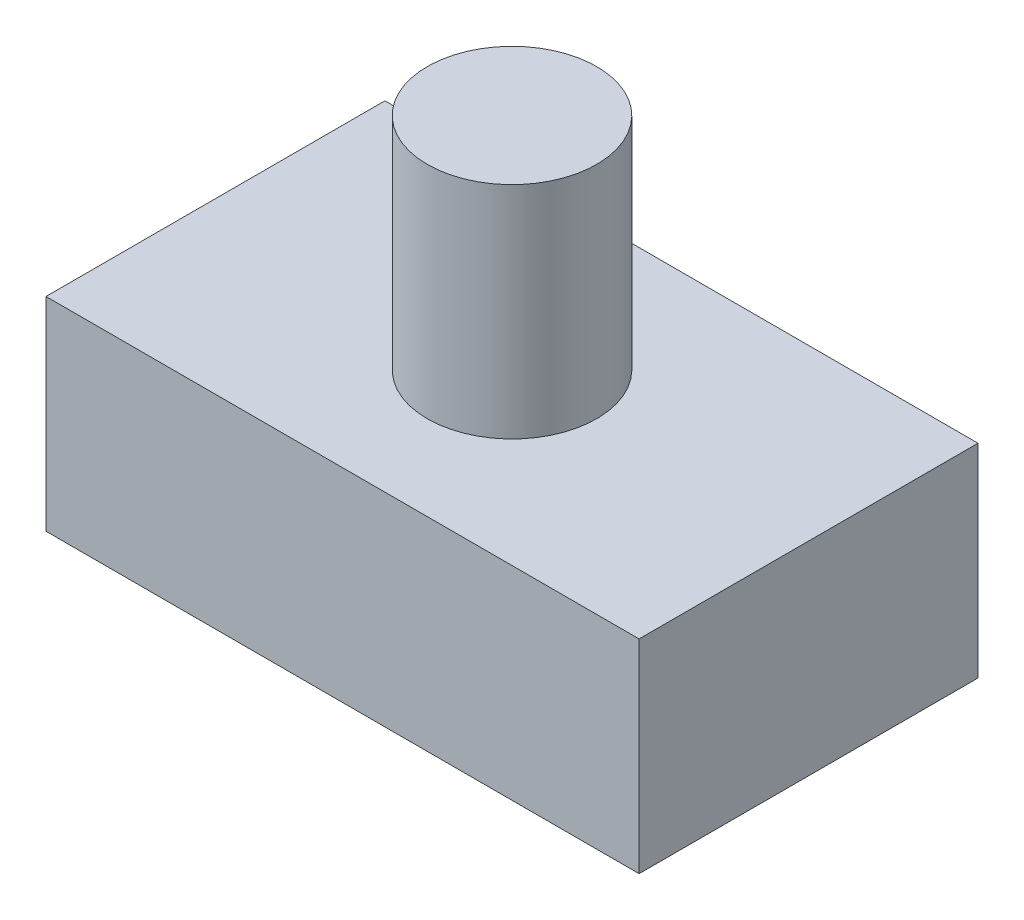
ISO-10303-21;
HEADER;
FILE_DESCRIPTION(('STEP AP214'),'2;1');
FILE_NAME('part.step','',(''),(''),'','','');
FILE_SCHEMA(('AUTOMOTIVE_DESIGN { 1 0 10303 214 1 1 1 1 }'));
ENDSEC;
DATA;
#1=APPLICATION_CONTEXT('core data for automotive mechanical design processes');
#2=APPLICATION_PROTOCOL_DEFINITION('international standard','automotive_design',2000,#1);
#3=PRODUCT_CONTEXT('',#1,'mechanical');
#4=PRODUCT('Part','Part','',(#3));
#5=PRODUCT_RELATED_PRODUCT_CATEGORY('part','',(#4));
#6=PRODUCT_DEFINITION_FORMATION('','',#4);
#7=PRODUCT_DEFINITION_CONTEXT('part definition',#1,'design');
#8=PRODUCT_DEFINITION('design','',#6,#7);
#9=PRODUCT_DEFINITION_SHAPE('','',#8);
#10=(LENGTH_UNIT() NAMED_UNIT(*) SI_UNIT(.MILLI.,.METRE.));
#11=(NAMED_UNIT(*) PLANE_ANGLE_UNIT() SI_UNIT($,.RADIAN.));
#12=(NAMED_UNIT(*) SI_UNIT($,.STERADIAN.) SOLID_ANGLE_UNIT());
#13=UNCERTAINTY_MEASURE_WITH_UNIT(LENGTH_MEASURE(1.E-05),#10,'distance_accuracy_value','');
#14=(GEOMETRIC_REPRESENTATION_CONTEXT(3) GLOBAL_UNCERTAINTY_ASSIGNED_CONTEXT((#13)) GLOBAL_UNIT_ASSIGNED_CONTEXT((#10,
#11,#12)) REPRESENTATION_CONTEXT('',''));
#15=CARTESIAN_POINT('',(0.,0.,0.));
#16=DIRECTION('',(0.,0.,1.));
#17=DIRECTION('',(1.,0.,0.));
#18=AXIS2_PLACEMENT_3D('',#15,#16,#17);
#19=CARTESIAN_POINT('',(0.,12.,0.));
#20=DIRECTION('',(0.,1.,0.));
#21=DIRECTION('',(0.,0.,1.));
#22=AXIS2_PLACEMENT_3D('',#19,#20,#21);
#23=PLANE('',#22);
#24=DIRECTION('',(0.,0.,-1.));
#25=VECTOR('',#24,1.);
#26=CARTESIAN_POINT('',(-17.5,12.,0.));
#27=LINE('',#26,#25);
#28=CARTESIAN_POINT('',(-17.5,12.,10.));
#29=VERTEX_POINT('',#28);
#30=CARTESIAN_POINT('',(-17.5,12.,-10.));
#31=VERTEX_POINT('',#30);
#32=EDGE_CURVE('E97',#29,#31,#27,.T.);
#33=ORIENTED_EDGE('',*,*,#32,.F.);
#34=DIRECTION('',(-1.,0.,0.));
#35=VECTOR('',#34,1.);
#36=CARTESIAN_POINT('',(0.,12.,10.));
#37=LINE('',#36,#35);
#38=CARTESIAN_POINT('',(17.5,12.,9.99999999999999));
#39=VERTEX_POINT('',#38);
#40=EDGE_CURVE('E89',#39,#29,#37,.T.);
#41=ORIENTED_EDGE('',*,*,#40,.F.);
#42=DIRECTION('',(0.,0.,-1.));
#43=VECTOR('',#42,1.);
#44=CARTESIAN_POINT('',(17.5,12.,0.));
#45=LINE('',#44,#43);
#46=CARTESIAN_POINT('',(17.5,12.,-10.));
#47=VERTEX_POINT('',#46);
#48=EDGE_CURVE('E93',#39,#47,#45,.T.);
#49=ORIENTED_EDGE('',*,*,#48,.T.);
#50=DIRECTION('',(-1.,0.,0.));
#51=VECTOR('',#50,1.);
#52=CARTESIAN_POINT('',(0.,12.,-10.));
#53=LINE('',#52,#51);
#54=EDGE_CURVE('E56',#47,#31,#53,.T.);
#55=ORIENTED_EDGE('',*,*,#54,.T.);
#56=EDGE_LOOP('',(#33,#41,#49,#55));
#57=FACE_BOUND('',#56,.T.);
#58=CARTESIAN_POINT('',(0.,12.,0.));
#59=DIRECTION('',(0.,1.,0.));
#60=DIRECTION('',(0.,0.,1.));
#61=AXIS2_PLACEMENT_3D('',#58,#59,#60);
#62=CIRCLE('',#61,5.);
#63=CARTESIAN_POINT('',(0.,12.,5.));
#64=VERTEX_POINT('',#63);
#65=EDGE_CURVE('E107',#64,#64,#62,.F.);
#66=ORIENTED_EDGE('',*,*,#65,.T.);
#67=EDGE_LOOP('',(#66));
#68=FACE_BOUND('',#67,.T.);
#69=ADVANCED_FACE('F39',(#57,#68),#23,.T.);
#70=CARTESIAN_POINT('',(-17.5,12.,0.));
#71=DIRECTION('',(-1.,0.,0.));
#72=DIRECTION('',(0.,0.,1.));
#73=AXIS2_PLACEMENT_3D('',#70,#71,#72);
#74=PLANE('',#73);
#75=DIRECTION('',(0.,0.,-1.));
#76=VECTOR('',#75,1.);
#77=CARTESIAN_POINT('',(-17.5,0.,0.));
#78=LINE('',#77,#76);
#79=CARTESIAN_POINT('',(-17.5,0.,10.));
#80=VERTEX_POINT('',#79);
#81=CARTESIAN_POINT('',(-17.5,0.,-10.));
#82=VERTEX_POINT('',#81);
#83=EDGE_CURVE('E104',#80,#82,#78,.T.);
#84=ORIENTED_EDGE('',*,*,#83,.F.);
#85=DIRECTION('',(0.,-1.,0.));
#86=VECTOR('',#85,1.);
#87=CARTESIAN_POINT('',(-17.5,12.,10.));
#88=LINE('',#87,#86);
#89=EDGE_CURVE('E11',#29,#80,#88,.T.);
#90=ORIENTED_EDGE('',*,*,#89,.F.);
#91=ORIENTED_EDGE('',*,*,#32,.T.);
#92=DIRECTION('',(0.,-1.,0.));
#93=VECTOR('',#92,1.);
#94=CARTESIAN_POINT('',(-17.5,12.,-10.));
#95=LINE('',#94,#93);
#96=EDGE_CURVE('E78',#31,#82,#95,.T.);
#97=ORIENTED_EDGE('',*,*,#96,.T.);
#98=EDGE_LOOP('',(#84,#90,#91,#97));
#99=FACE_BOUND('',#98,.T.);
#100=ADVANCED_FACE('F41',(#99),#74,.T.);
#101=CARTESIAN_POINT('',(0.,12.,10.));
#102=DIRECTION('',(0.,0.,1.));
#103=DIRECTION('',(1.,0.,0.));
#104=AXIS2_PLACEMENT_3D('',#101,#102,#103);
#105=PLANE('',#104);
#106=DIRECTION('',(-1.,0.,0.));
#107=VECTOR('',#106,1.);
#108=CARTESIAN_POINT('',(0.,0.,10.));
#109=LINE('',#108,#107);
#110=CARTESIAN_POINT('',(17.5,0.,9.99999999999999));
#111=VERTEX_POINT('',#110);
#112=EDGE_CURVE('E91',#111,#80,#109,.T.);
#113=ORIENTED_EDGE('',*,*,#112,.F.);
#114=DIRECTION('',(0.,-1.,0.));
#115=VECTOR('',#114,1.);
#116=CARTESIAN_POINT('',(17.5,12.,9.99999999999999));
#117=LINE('',#116,#115);
#118=EDGE_CURVE('E48',#39,#111,#117,.T.);
#119=ORIENTED_EDGE('',*,*,#118,.F.);
#120=ORIENTED_EDGE('',*,*,#40,.T.);
#121=ORIENTED_EDGE('',*,*,#89,.T.);
#122=EDGE_LOOP('',(#113,#119,#120,#121));
#123=FACE_BOUND('',#122,.T.);
#124=ADVANCED_FACE('F87',(#123),#105,.T.);
#125=CARTESIAN_POINT('',(17.5,12.,0.));
#126=DIRECTION('',(-1.,0.,0.));
#127=DIRECTION('',(0.,0.,1.));
#128=AXIS2_PLACEMENT_3D('',#125,#126,#127);
#129=PLANE('',#128);
#130=DIRECTION('',(0.,0.,-1.));
#131=VECTOR('',#130,1.);
#132=CARTESIAN_POINT('',(17.5,0.,0.));
#133=LINE('',#132,#131);
#134=CARTESIAN_POINT('',(17.5,0.,-10.));
#135=VERTEX_POINT('',#134);
#136=EDGE_CURVE('E71',#111,#135,#133,.T.);
#137=ORIENTED_EDGE('',*,*,#136,.T.);
#138=DIRECTION('',(0.,-1.,0.));
#139=VECTOR('',#138,1.);
#140=CARTESIAN_POINT('',(17.5,12.,-10.));
#141=LINE('',#140,#139);
#142=EDGE_CURVE('E92',#47,#135,#141,.T.);
#143=ORIENTED_EDGE('',*,*,#142,.F.);
#144=ORIENTED_EDGE('',*,*,#48,.F.);
#145=ORIENTED_EDGE('',*,*,#118,.T.);
#146=EDGE_LOOP('',(#137,#143,#144,#145));
#147=FACE_BOUND('',#146,.T.);
#148=ADVANCED_FACE('F94',(#147),#129,.F.);
#149=CARTESIAN_POINT('',(0.,12.,-10.));
#150=DIRECTION('',(0.,0.,1.));
#151=DIRECTION('',(1.,0.,0.));
#152=AXIS2_PLACEMENT_3D('',#149,#150,#151);
#153=PLANE('',#152);
#154=DIRECTION('',(-1.,0.,0.));
#155=VECTOR('',#154,1.);
#156=CARTESIAN_POINT('',(0.,0.,-10.));
#157=LINE('',#156,#155);
#158=EDGE_CURVE('E99',#135,#82,#157,.T.);
#159=ORIENTED_EDGE('',*,*,#158,.T.);
#160=ORIENTED_EDGE('',*,*,#96,.F.);
#161=ORIENTED_EDGE('',*,*,#54,.F.);
#162=ORIENTED_EDGE('',*,*,#142,.T.);
#163=EDGE_LOOP('',(#159,#160,#161,#162));
#164=FACE_BOUND('',#163,.T.);
#165=ADVANCED_FACE('F114',(#164),#153,.F.);
#166=CARTESIAN_POINT('',(0.,0.,0.));
#167=DIRECTION('',(0.,1.,0.));
#168=DIRECTION('',(0.,0.,1.));
#169=AXIS2_PLACEMENT_3D('',#166,#167,#168);
#170=PLANE('',#169);
#171=ORIENTED_EDGE('',*,*,#83,.T.);
#172=ORIENTED_EDGE('',*,*,#158,.F.);
#173=ORIENTED_EDGE('',*,*,#136,.F.);
#174=ORIENTED_EDGE('',*,*,#112,.T.);
#175=EDGE_LOOP('',(#171,#172,#173,#174));
#176=FACE_BOUND('',#175,.T.);
#177=ADVANCED_FACE('F116',(#176),#170,.F.);
#178=CARTESIAN_POINT('',(0.,25.,0.));
#179=DIRECTION('',(0.,-1.,0.));
#180=DIRECTION('',(0.,0.,-1.));
#181=AXIS2_PLACEMENT_3D('',#178,#179,#180);
#182=CYLINDRICAL_SURFACE('',#181,5.);
#183=ORIENTED_EDGE('',*,*,#65,.F.);
#184=EDGE_LOOP('',(#183));
#185=FACE_BOUND('',#184,.T.);
#186=CARTESIAN_POINT('',(0.,25.,0.));
#187=DIRECTION('',(0.,1.,0.));
#188=DIRECTION('',(0.,0.,1.));
#189=AXIS2_PLACEMENT_3D('',#186,#187,#188);
#190=CIRCLE('',#189,5.);
#191=CARTESIAN_POINT('',(0.,25.,5.));
#192=VERTEX_POINT('',#191);
#193=EDGE_CURVE('E165',#192,#192,#190,.T.);
#194=ORIENTED_EDGE('',*,*,#193,.F.);
#195=EDGE_LOOP('',(#194));
#196=FACE_BOUND('',#195,.T.);
#197=ADVANCED_FACE('F129',(#185,#196),#182,.T.);
#198=CARTESIAN_POINT('',(0.,25.,0.));
#199=DIRECTION('',(0.,1.,0.));
#200=DIRECTION('',(0.,0.,1.));
#201=AXIS2_PLACEMENT_3D('',#198,#199,#200);
#202=PLANE('',#201);
#203=ORIENTED_EDGE('',*,*,#193,.T.);
#204=EDGE_LOOP('',(#203));
#205=FACE_BOUND('',#204,.T.);
#206=ADVANCED_FACE('F155',(#205),#202,.T.);
#207=CLOSED_SHELL('',(#69,#100,#124,#148,#165,#177,#197,#206));
#208=MANIFOLD_SOLID_BREP('B2',#207);
#209=ADVANCED_BREP_SHAPE_REPRESENTATION('',(#18,#208),#14);
#210=SHAPE_DEFINITION_REPRESENTATION(#9,#209);
ENDSEC;
END-ISO-10303-21;
